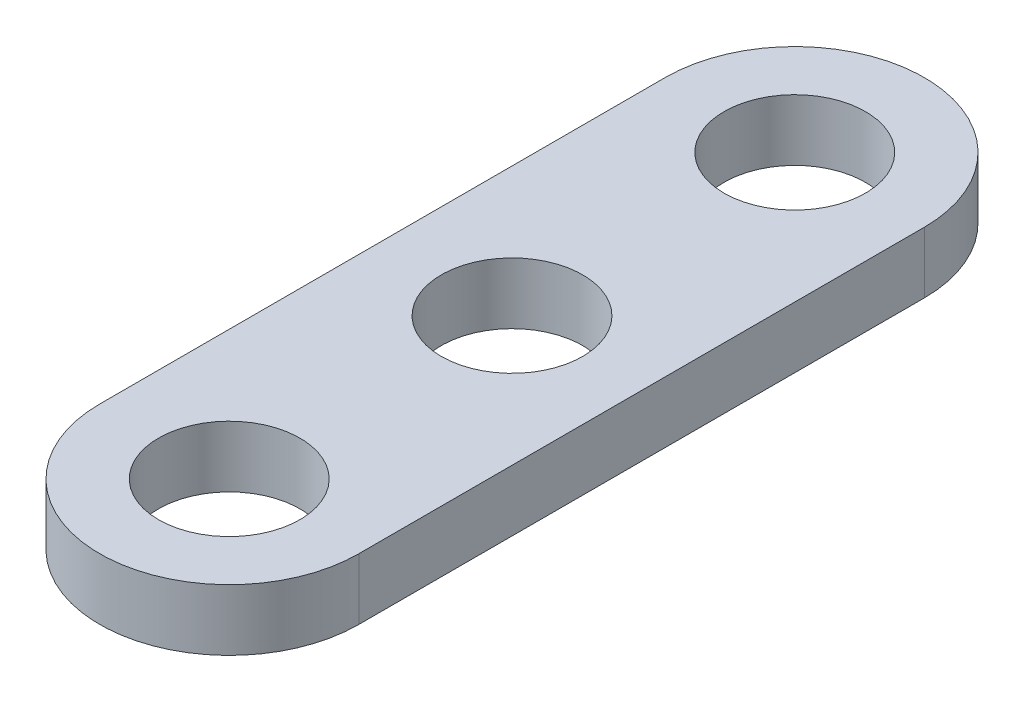
ISO-10303-21;
HEADER;
FILE_DESCRIPTION(('STEP AP214'),'2;1');
FILE_NAME('part.step','',(''),(''),'','','');
FILE_SCHEMA(('AUTOMOTIVE_DESIGN { 1 0 10303 214 1 1 1 1 }'));
ENDSEC;
DATA;
#1=APPLICATION_CONTEXT('core data for automotive mechanical design processes');
#2=APPLICATION_PROTOCOL_DEFINITION('international standard','automotive_design',2000,#1);
#3=PRODUCT_CONTEXT('',#1,'mechanical');
#4=PRODUCT('Part','Part','',(#3));
#5=PRODUCT_RELATED_PRODUCT_CATEGORY('part','',(#4));
#6=PRODUCT_DEFINITION_FORMATION('','',#4);
#7=PRODUCT_DEFINITION_CONTEXT('part definition',#1,'design');
#8=PRODUCT_DEFINITION('design','',#6,#7);
#9=PRODUCT_DEFINITION_SHAPE('','',#8);
#10=(LENGTH_UNIT() NAMED_UNIT(*) SI_UNIT(.MILLI.,.METRE.));
#11=(NAMED_UNIT(*) PLANE_ANGLE_UNIT() SI_UNIT($,.RADIAN.));
#12=(NAMED_UNIT(*) SI_UNIT($,.STERADIAN.) SOLID_ANGLE_UNIT());
#13=UNCERTAINTY_MEASURE_WITH_UNIT(LENGTH_MEASURE(1.E-05),#10,'distance_accuracy_value','');
#14=(GEOMETRIC_REPRESENTATION_CONTEXT(3) GLOBAL_UNCERTAINTY_ASSIGNED_CONTEXT((#13)) GLOBAL_UNIT_ASSIGNED_CONTEXT((#10,
#11,#12)) REPRESENTATION_CONTEXT('',''));
#15=CARTESIAN_POINT('',(0.,0.,0.));
#16=DIRECTION('',(0.,0.,1.));
#17=DIRECTION('',(1.,0.,0.));
#18=AXIS2_PLACEMENT_3D('',#15,#16,#17);
#19=CARTESIAN_POINT('',(1.24958540118864E-13,2.6,12.));
#20=DIRECTION('',(0.,1.,0.));
#21=DIRECTION('',(0.,0.,1.));
#22=AXIS2_PLACEMENT_3D('',#19,#20,#21);
#23=PLANE('',#22);
#24=CARTESIAN_POINT('',(0.,2.6,-12.));
#25=DIRECTION('',(0.,1.,0.));
#26=DIRECTION('',(0.,0.,1.));
#27=AXIS2_PLACEMENT_3D('',#24,#25,#26);
#28=CIRCLE('',#27,3.);
#29=CARTESIAN_POINT('',(0.,2.6,-9.));
#30=VERTEX_POINT('',#29);
#31=EDGE_CURVE('E116',#30,#30,#28,.T.);
#32=ORIENTED_EDGE('',*,*,#31,.F.);
#33=EDGE_LOOP('',(#32));
#34=FACE_BOUND('',#33,.T.);
#35=CARTESIAN_POINT('',(1.24958540118864E-13,2.6,12.));
#36=DIRECTION('',(0.,1.,0.));
#37=DIRECTION('',(0.,0.,1.));
#38=AXIS2_PLACEMENT_3D('',#35,#36,#37);
#39=CIRCLE('',#38,5.50000000000004);
#40=CARTESIAN_POINT('',(-5.50000000000004,2.6,12.));
#41=VERTEX_POINT('',#40);
#42=CARTESIAN_POINT('',(5.50000000000004,2.6,12.));
#43=VERTEX_POINT('',#42);
#44=EDGE_CURVE('E86',#41,#43,#39,.T.);
#45=ORIENTED_EDGE('',*,*,#44,.T.);
#46=DIRECTION('',(0.,0.,-1.));
#47=VECTOR('',#46,1.);
#48=CARTESIAN_POINT('',(5.50000000000004,2.6,12.));
#49=LINE('',#48,#47);
#50=CARTESIAN_POINT('',(5.5,2.6,-12.));
#51=VERTEX_POINT('',#50);
#52=EDGE_CURVE('E81',#43,#51,#49,.T.);
#53=ORIENTED_EDGE('',*,*,#52,.T.);
#54=CARTESIAN_POINT('',(0.,2.6,-12.));
#55=DIRECTION('',(0.,1.,0.));
#56=DIRECTION('',(0.,0.,1.));
#57=AXIS2_PLACEMENT_3D('',#54,#55,#56);
#58=CIRCLE('',#57,5.50000000000004);
#59=CARTESIAN_POINT('',(-5.50000000000004,2.6,-12.));
#60=VERTEX_POINT('',#59);
#61=EDGE_CURVE('E84',#51,#60,#58,.T.);
#62=ORIENTED_EDGE('',*,*,#61,.T.);
#63=DIRECTION('',(0.,0.,1.));
#64=VECTOR('',#63,1.);
#65=CARTESIAN_POINT('',(-5.50000000000004,2.6,12.));
#66=LINE('',#65,#64);
#67=EDGE_CURVE('E51',#60,#41,#66,.T.);
#68=ORIENTED_EDGE('',*,*,#67,.T.);
#69=EDGE_LOOP('',(#45,#53,#62,#68));
#70=FACE_BOUND('',#69,.T.);
#71=CARTESIAN_POINT('',(0.,2.6,0.));
#72=DIRECTION('',(0.,1.,0.));
#73=DIRECTION('',(0.,0.,1.));
#74=AXIS2_PLACEMENT_3D('',#71,#72,#73);
#75=CIRCLE('',#74,3.);
#76=CARTESIAN_POINT('',(0.,2.6,3.));
#77=VERTEX_POINT('',#76);
#78=EDGE_CURVE('E101',#77,#77,#75,.T.);
#79=ORIENTED_EDGE('',*,*,#78,.F.);
#80=EDGE_LOOP('',(#79));
#81=FACE_BOUND('',#80,.T.);
#82=CARTESIAN_POINT('',(1.24958540118864E-13,2.6,12.));
#83=DIRECTION('',(0.,1.,0.));
#84=DIRECTION('',(0.,0.,1.));
#85=AXIS2_PLACEMENT_3D('',#82,#83,#84);
#86=CIRCLE('',#85,3.);
#87=CARTESIAN_POINT('',(1.24958540118864E-13,2.6,15.));
#88=VERTEX_POINT('',#87);
#89=EDGE_CURVE('E122',#88,#88,#86,.T.);
#90=ORIENTED_EDGE('',*,*,#89,.F.);
#91=EDGE_LOOP('',(#90));
#92=FACE_BOUND('',#91,.T.);
#93=ADVANCED_FACE('F34',(#34,#70,#81,#92),#23,.T.);
#94=CARTESIAN_POINT('',(1.24958540118864E-13,0.,12.));
#95=DIRECTION('',(0.,1.,0.));
#96=DIRECTION('',(0.,0.,1.));
#97=AXIS2_PLACEMENT_3D('',#94,#95,#96);
#98=PLANE('',#97);
#99=CARTESIAN_POINT('',(1.24958540118864E-13,0.,12.));
#100=DIRECTION('',(0.,1.,0.));
#101=DIRECTION('',(0.,0.,1.));
#102=AXIS2_PLACEMENT_3D('',#99,#100,#101);
#103=CIRCLE('',#102,5.50000000000004);
#104=CARTESIAN_POINT('',(-5.50000000000004,0.,12.));
#105=VERTEX_POINT('',#104);
#106=CARTESIAN_POINT('',(5.50000000000004,0.,12.));
#107=VERTEX_POINT('',#106);
#108=EDGE_CURVE('E98',#105,#107,#103,.T.);
#109=ORIENTED_EDGE('',*,*,#108,.F.);
#110=DIRECTION('',(0.,0.,1.));
#111=VECTOR('',#110,1.);
#112=CARTESIAN_POINT('',(-5.50000000000004,0.,12.));
#113=LINE('',#112,#111);
#114=CARTESIAN_POINT('',(-5.50000000000004,0.,-12.));
#115=VERTEX_POINT('',#114);
#116=EDGE_CURVE('E74',#115,#105,#113,.T.);
#117=ORIENTED_EDGE('',*,*,#116,.F.);
#118=CARTESIAN_POINT('',(0.,0.,-12.));
#119=DIRECTION('',(0.,1.,0.));
#120=DIRECTION('',(0.,0.,1.));
#121=AXIS2_PLACEMENT_3D('',#118,#119,#120);
#122=CIRCLE('',#121,5.50000000000004);
#123=CARTESIAN_POINT('',(5.5,0.,-12.));
#124=VERTEX_POINT('',#123);
#125=EDGE_CURVE('E68',#124,#115,#122,.T.);
#126=ORIENTED_EDGE('',*,*,#125,.F.);
#127=DIRECTION('',(0.,0.,-1.));
#128=VECTOR('',#127,1.);
#129=CARTESIAN_POINT('',(5.50000000000004,0.,12.));
#130=LINE('',#129,#128);
#131=EDGE_CURVE('E90',#107,#124,#130,.T.);
#132=ORIENTED_EDGE('',*,*,#131,.F.);
#133=EDGE_LOOP('',(#109,#117,#126,#132));
#134=FACE_BOUND('',#133,.T.);
#135=CARTESIAN_POINT('',(0.,0.,0.));
#136=DIRECTION('',(0.,1.,0.));
#137=DIRECTION('',(0.,0.,1.));
#138=AXIS2_PLACEMENT_3D('',#135,#136,#137);
#139=CIRCLE('',#138,3.);
#140=CARTESIAN_POINT('',(0.,0.,3.));
#141=VERTEX_POINT('',#140);
#142=EDGE_CURVE('E113',#141,#141,#139,.T.);
#143=ORIENTED_EDGE('',*,*,#142,.T.);
#144=EDGE_LOOP('',(#143));
#145=FACE_BOUND('',#144,.T.);
#146=CARTESIAN_POINT('',(0.,0.,-12.));
#147=DIRECTION('',(0.,1.,0.));
#148=DIRECTION('',(0.,0.,1.));
#149=AXIS2_PLACEMENT_3D('',#146,#147,#148);
#150=CIRCLE('',#149,3.);
#151=CARTESIAN_POINT('',(0.,0.,-9.));
#152=VERTEX_POINT('',#151);
#153=EDGE_CURVE('E119',#152,#152,#150,.T.);
#154=ORIENTED_EDGE('',*,*,#153,.T.);
#155=EDGE_LOOP('',(#154));
#156=FACE_BOUND('',#155,.T.);
#157=CARTESIAN_POINT('',(1.24958540118864E-13,0.,12.));
#158=DIRECTION('',(0.,1.,0.));
#159=DIRECTION('',(0.,0.,1.));
#160=AXIS2_PLACEMENT_3D('',#157,#158,#159);
#161=CIRCLE('',#160,3.);
#162=CARTESIAN_POINT('',(1.24958540118864E-13,0.,15.));
#163=VERTEX_POINT('',#162);
#164=EDGE_CURVE('E125',#163,#163,#161,.T.);
#165=ORIENTED_EDGE('',*,*,#164,.T.);
#166=EDGE_LOOP('',(#165));
#167=FACE_BOUND('',#166,.T.);
#168=ADVANCED_FACE('F109',(#134,#145,#156,#167),#98,.F.);
#169=CARTESIAN_POINT('',(1.24958540118864E-13,2.6,12.));
#170=DIRECTION('',(0.,-1.,0.));
#171=DIRECTION('',(0.,0.,-1.));
#172=AXIS2_PLACEMENT_3D('',#169,#170,#171);
#173=CYLINDRICAL_SURFACE('',#172,5.50000000000004);
#174=ORIENTED_EDGE('',*,*,#108,.T.);
#175=DIRECTION('',(0.,-1.,0.));
#176=VECTOR('',#175,1.);
#177=CARTESIAN_POINT('',(5.50000000000004,2.6,12.));
#178=LINE('',#177,#176);
#179=EDGE_CURVE('E11',#43,#107,#178,.T.);
#180=ORIENTED_EDGE('',*,*,#179,.F.);
#181=ORIENTED_EDGE('',*,*,#44,.F.);
#182=DIRECTION('',(0.,-1.,0.));
#183=VECTOR('',#182,1.);
#184=CARTESIAN_POINT('',(-5.50000000000004,2.6,12.));
#185=LINE('',#184,#183);
#186=EDGE_CURVE('E94',#41,#105,#185,.T.);
#187=ORIENTED_EDGE('',*,*,#186,.T.);
#188=EDGE_LOOP('',(#174,#180,#181,#187));
#189=FACE_BOUND('',#188,.T.);
#190=ADVANCED_FACE('F36',(#189),#173,.T.);
#191=CARTESIAN_POINT('',(5.50000000000004,2.6,12.));
#192=DIRECTION('',(-1.,0.,0.));
#193=DIRECTION('',(0.,0.,1.));
#194=AXIS2_PLACEMENT_3D('',#191,#192,#193);
#195=PLANE('',#194);
#196=ORIENTED_EDGE('',*,*,#131,.T.);
#197=DIRECTION('',(0.,-1.,0.));
#198=VECTOR('',#197,1.);
#199=CARTESIAN_POINT('',(5.5,2.6,-12.));
#200=LINE('',#199,#198);
#201=EDGE_CURVE('E43',#51,#124,#200,.T.);
#202=ORIENTED_EDGE('',*,*,#201,.F.);
#203=ORIENTED_EDGE('',*,*,#52,.F.);
#204=ORIENTED_EDGE('',*,*,#179,.T.);
#205=EDGE_LOOP('',(#196,#202,#203,#204));
#206=FACE_BOUND('',#205,.T.);
#207=ADVANCED_FACE('F89',(#206),#195,.F.);
#208=CARTESIAN_POINT('',(0.,2.6,-12.));
#209=DIRECTION('',(0.,-1.,0.));
#210=DIRECTION('',(0.,0.,-1.));
#211=AXIS2_PLACEMENT_3D('',#208,#209,#210);
#212=CYLINDRICAL_SURFACE('',#211,5.50000000000004);
#213=ORIENTED_EDGE('',*,*,#125,.T.);
#214=DIRECTION('',(0.,-1.,0.));
#215=VECTOR('',#214,1.);
#216=CARTESIAN_POINT('',(-5.50000000000004,2.6,-12.));
#217=LINE('',#216,#215);
#218=EDGE_CURVE('E91',#60,#115,#217,.T.);
#219=ORIENTED_EDGE('',*,*,#218,.F.);
#220=ORIENTED_EDGE('',*,*,#61,.F.);
#221=ORIENTED_EDGE('',*,*,#201,.T.);
#222=EDGE_LOOP('',(#213,#219,#220,#221));
#223=FACE_BOUND('',#222,.T.);
#224=ADVANCED_FACE('F92',(#223),#212,.T.);
#225=CARTESIAN_POINT('',(-5.50000000000004,2.6,12.));
#226=DIRECTION('',(1.,0.,0.));
#227=DIRECTION('',(0.,0.,-1.));
#228=AXIS2_PLACEMENT_3D('',#225,#226,#227);
#229=PLANE('',#228);
#230=ORIENTED_EDGE('',*,*,#116,.T.);
#231=ORIENTED_EDGE('',*,*,#186,.F.);
#232=ORIENTED_EDGE('',*,*,#67,.F.);
#233=ORIENTED_EDGE('',*,*,#218,.T.);
#234=EDGE_LOOP('',(#230,#231,#232,#233));
#235=FACE_BOUND('',#234,.T.);
#236=ADVANCED_FACE('F106',(#235),#229,.F.);
#237=CARTESIAN_POINT('',(0.,2.6,0.));
#238=DIRECTION('',(0.,-1.,0.));
#239=DIRECTION('',(0.,0.,-1.));
#240=AXIS2_PLACEMENT_3D('',#237,#238,#239);
#241=CYLINDRICAL_SURFACE('',#240,3.);
#242=ORIENTED_EDGE('',*,*,#78,.T.);
#243=EDGE_LOOP('',(#242));
#244=FACE_BOUND('',#243,.T.);
#245=ORIENTED_EDGE('',*,*,#142,.F.);
#246=EDGE_LOOP('',(#245));
#247=FACE_BOUND('',#246,.T.);
#248=ADVANCED_FACE('F143',(#244,#247),#241,.F.);
#249=CARTESIAN_POINT('',(0.,2.6,-12.));
#250=DIRECTION('',(0.,-1.,0.));
#251=DIRECTION('',(0.,0.,-1.));
#252=AXIS2_PLACEMENT_3D('',#249,#250,#251);
#253=CYLINDRICAL_SURFACE('',#252,3.);
#254=ORIENTED_EDGE('',*,*,#31,.T.);
#255=EDGE_LOOP('',(#254));
#256=FACE_BOUND('',#255,.T.);
#257=ORIENTED_EDGE('',*,*,#153,.F.);
#258=EDGE_LOOP('',(#257));
#259=FACE_BOUND('',#258,.T.);
#260=ADVANCED_FACE('F189',(#256,#259),#253,.F.);
#261=CARTESIAN_POINT('',(1.24958540118864E-13,2.6,12.));
#262=DIRECTION('',(0.,-1.,0.));
#263=DIRECTION('',(0.,0.,-1.));
#264=AXIS2_PLACEMENT_3D('',#261,#262,#263);
#265=CYLINDRICAL_SURFACE('',#264,3.);
#266=ORIENTED_EDGE('',*,*,#89,.T.);
#267=EDGE_LOOP('',(#266));
#268=FACE_BOUND('',#267,.T.);
#269=ORIENTED_EDGE('',*,*,#164,.F.);
#270=EDGE_LOOP('',(#269));
#271=FACE_BOUND('',#270,.T.);
#272=ADVANCED_FACE('F131',(#268,#271),#265,.F.);
#273=CLOSED_SHELL('',(#93,#168,#190,#207,#224,#236,#248,#260,#272));
#274=MANIFOLD_SOLID_BREP('B2',#273);
#275=ADVANCED_BREP_SHAPE_REPRESENTATION('',(#18,#274),#14);
#276=SHAPE_DEFINITION_REPRESENTATION(#9,#275);
ENDSEC;
END-ISO-10303-21;
